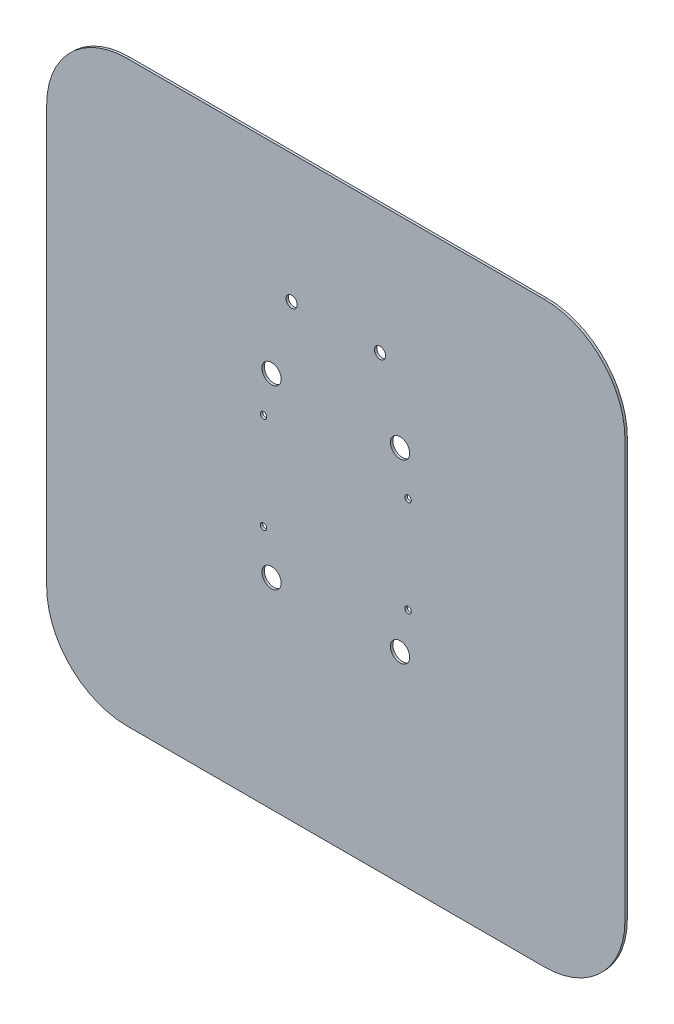
ISO-10303-21;
HEADER;
FILE_DESCRIPTION(('STEP AP214'),'2;1');
FILE_NAME('part.step','',(''),(''),'','','');
FILE_SCHEMA(('AUTOMOTIVE_DESIGN { 1 0 10303 214 1 1 1 1 }'));
ENDSEC;
DATA;
#1=APPLICATION_CONTEXT('core data for automotive mechanical design processes');
#2=APPLICATION_PROTOCOL_DEFINITION('international standard','automotive_design',2000,#1);
#3=PRODUCT_CONTEXT('',#1,'mechanical');
#4=PRODUCT('Part','Part','',(#3));
#5=PRODUCT_RELATED_PRODUCT_CATEGORY('part','',(#4));
#6=PRODUCT_DEFINITION_FORMATION('','',#4);
#7=PRODUCT_DEFINITION_CONTEXT('part definition',#1,'design');
#8=PRODUCT_DEFINITION('design','',#6,#7);
#9=PRODUCT_DEFINITION_SHAPE('','',#8);
#10=(LENGTH_UNIT() NAMED_UNIT(*) SI_UNIT(.MILLI.,.METRE.));
#11=(NAMED_UNIT(*) PLANE_ANGLE_UNIT() SI_UNIT($,.RADIAN.));
#12=(NAMED_UNIT(*) SI_UNIT($,.STERADIAN.) SOLID_ANGLE_UNIT());
#13=UNCERTAINTY_MEASURE_WITH_UNIT(LENGTH_MEASURE(1.E-05),#10,'distance_accuracy_value','');
#14=(GEOMETRIC_REPRESENTATION_CONTEXT(3) GLOBAL_UNCERTAINTY_ASSIGNED_CONTEXT((#13)) GLOBAL_UNIT_ASSIGNED_CONTEXT((#10,
#11,#12)) REPRESENTATION_CONTEXT('',''));
#15=CARTESIAN_POINT('',(0.,0.,0.));
#16=DIRECTION('',(0.,0.,1.));
#17=DIRECTION('',(1.,0.,0.));
#18=AXIS2_PLACEMENT_3D('',#15,#16,#17);
#19=CARTESIAN_POINT('',(50.,50.,1.5));
#20=DIRECTION('',(0.,0.,-1.));
#21=DIRECTION('',(-1.,0.,0.));
#22=AXIS2_PLACEMENT_3D('',#19,#20,#21);
#23=CYLINDRICAL_SURFACE('',#22,50.);
#24=CARTESIAN_POINT('',(50.,50.,0.));
#25=DIRECTION('',(0.,0.,1.));
#26=DIRECTION('',(1.,0.,0.));
#27=AXIS2_PLACEMENT_3D('',#24,#25,#26);
#28=CIRCLE('',#27,50.);
#29=CARTESIAN_POINT('',(0.,50.,0.));
#30=VERTEX_POINT('',#29);
#31=CARTESIAN_POINT('',(50.,0.,0.));
#32=VERTEX_POINT('',#31);
#33=EDGE_CURVE('E132',#30,#32,#28,.T.);
#34=ORIENTED_EDGE('',*,*,#33,.T.);
#35=DIRECTION('',(0.,0.,-1.));
#36=VECTOR('',#35,1.);
#37=CARTESIAN_POINT('',(50.,0.,1.5));
#38=LINE('',#37,#36);
#39=CARTESIAN_POINT('',(50.,0.,1.5));
#40=VERTEX_POINT('',#39);
#41=EDGE_CURVE('E11',#40,#32,#38,.T.);
#42=ORIENTED_EDGE('',*,*,#41,.F.);
#43=CARTESIAN_POINT('',(50.,50.,1.5));
#44=DIRECTION('',(0.,0.,1.));
#45=DIRECTION('',(1.,0.,0.));
#46=AXIS2_PLACEMENT_3D('',#43,#44,#45);
#47=CIRCLE('',#46,50.);
#48=CARTESIAN_POINT('',(0.,50.,1.5));
#49=VERTEX_POINT('',#48);
#50=EDGE_CURVE('E152',#49,#40,#47,.T.);
#51=ORIENTED_EDGE('',*,*,#50,.F.);
#52=DIRECTION('',(0.,0.,-1.));
#53=VECTOR('',#52,1.);
#54=CARTESIAN_POINT('',(0.,50.,1.5));
#55=LINE('',#54,#53);
#56=EDGE_CURVE('E52',#49,#30,#55,.T.);
#57=ORIENTED_EDGE('',*,*,#56,.T.);
#58=EDGE_LOOP('',(#34,#42,#51,#57));
#59=FACE_BOUND('',#58,.T.);
#60=ADVANCED_FACE('F36',(#59),#23,.T.);
#61=CARTESIAN_POINT('',(50.,0.,1.5));
#62=DIRECTION('',(0.,1.,0.));
#63=DIRECTION('',(0.,0.,1.));
#64=AXIS2_PLACEMENT_3D('',#61,#62,#63);
#65=PLANE('',#64);
#66=DIRECTION('',(1.,0.,0.));
#67=VECTOR('',#66,1.);
#68=CARTESIAN_POINT('',(50.,0.,0.));
#69=LINE('',#68,#67);
#70=CARTESIAN_POINT('',(310.,0.,0.));
#71=VERTEX_POINT('',#70);
#72=EDGE_CURVE('E134',#32,#71,#69,.T.);
#73=ORIENTED_EDGE('',*,*,#72,.T.);
#74=DIRECTION('',(0.,0.,-1.));
#75=VECTOR('',#74,1.);
#76=CARTESIAN_POINT('',(310.,0.,1.5));
#77=LINE('',#76,#75);
#78=CARTESIAN_POINT('',(310.,0.,1.5));
#79=VERTEX_POINT('',#78);
#80=EDGE_CURVE('E44',#79,#71,#77,.T.);
#81=ORIENTED_EDGE('',*,*,#80,.F.);
#82=DIRECTION('',(1.,0.,0.));
#83=VECTOR('',#82,1.);
#84=CARTESIAN_POINT('',(50.,0.,1.5));
#85=LINE('',#84,#83);
#86=EDGE_CURVE('E90',#40,#79,#85,.T.);
#87=ORIENTED_EDGE('',*,*,#86,.F.);
#88=ORIENTED_EDGE('',*,*,#41,.T.);
#89=EDGE_LOOP('',(#73,#81,#87,#88));
#90=FACE_BOUND('',#89,.T.);
#91=ADVANCED_FACE('F166',(#90),#65,.F.);
#92=CARTESIAN_POINT('',(310.,50.,1.5));
#93=DIRECTION('',(0.,0.,-1.));
#94=DIRECTION('',(-1.,0.,0.));
#95=AXIS2_PLACEMENT_3D('',#92,#93,#94);
#96=CYLINDRICAL_SURFACE('',#95,50.);
#97=CARTESIAN_POINT('',(310.,50.,0.));
#98=DIRECTION('',(0.,0.,-1.));
#99=DIRECTION('',(-1.,0.,0.));
#100=AXIS2_PLACEMENT_3D('',#97,#98,#99);
#101=CIRCLE('',#100,50.);
#102=CARTESIAN_POINT('',(360.,50.,0.));
#103=VERTEX_POINT('',#102);
#104=EDGE_CURVE('E138',#103,#71,#101,.T.);
#105=ORIENTED_EDGE('',*,*,#104,.F.);
#106=DIRECTION('',(0.,0.,-1.));
#107=VECTOR('',#106,1.);
#108=CARTESIAN_POINT('',(360.,50.,1.5));
#109=LINE('',#108,#107);
#110=CARTESIAN_POINT('',(360.,50.,1.5));
#111=VERTEX_POINT('',#110);
#112=EDGE_CURVE('E159',#111,#103,#109,.T.);
#113=ORIENTED_EDGE('',*,*,#112,.F.);
#114=CARTESIAN_POINT('',(310.,50.,1.5));
#115=DIRECTION('',(0.,0.,-1.));
#116=DIRECTION('',(-1.,0.,0.));
#117=AXIS2_PLACEMENT_3D('',#114,#115,#116);
#118=CIRCLE('',#117,50.);
#119=EDGE_CURVE('E165',#111,#79,#118,.T.);
#120=ORIENTED_EDGE('',*,*,#119,.T.);
#121=ORIENTED_EDGE('',*,*,#80,.T.);
#122=EDGE_LOOP('',(#105,#113,#120,#121));
#123=FACE_BOUND('',#122,.T.);
#124=ADVANCED_FACE('F163',(#123),#96,.T.);
#125=CARTESIAN_POINT('',(360.,50.,1.5));
#126=DIRECTION('',(-1.,0.,0.));
#127=DIRECTION('',(0.,-1.,0.));
#128=AXIS2_PLACEMENT_3D('',#125,#126,#127);
#129=PLANE('',#128);
#130=DIRECTION('',(0.,1.,0.));
#131=VECTOR('',#130,1.);
#132=CARTESIAN_POINT('',(360.,50.,0.));
#133=LINE('',#132,#131);
#134=CARTESIAN_POINT('',(360.,310.,0.));
#135=VERTEX_POINT('',#134);
#136=EDGE_CURVE('E141',#103,#135,#133,.T.);
#137=ORIENTED_EDGE('',*,*,#136,.T.);
#138=DIRECTION('',(0.,0.,-1.));
#139=VECTOR('',#138,1.);
#140=CARTESIAN_POINT('',(360.,310.,1.5));
#141=LINE('',#140,#139);
#142=CARTESIAN_POINT('',(360.,310.,1.5));
#143=VERTEX_POINT('',#142);
#144=EDGE_CURVE('E156',#143,#135,#141,.T.);
#145=ORIENTED_EDGE('',*,*,#144,.F.);
#146=DIRECTION('',(0.,1.,0.));
#147=VECTOR('',#146,1.);
#148=CARTESIAN_POINT('',(360.,50.,1.5));
#149=LINE('',#148,#147);
#150=EDGE_CURVE('E178',#111,#143,#149,.T.);
#151=ORIENTED_EDGE('',*,*,#150,.F.);
#152=ORIENTED_EDGE('',*,*,#112,.T.);
#153=EDGE_LOOP('',(#137,#145,#151,#152));
#154=FACE_BOUND('',#153,.T.);
#155=ADVANCED_FACE('F174',(#154),#129,.F.);
#156=CARTESIAN_POINT('',(310.,310.,1.5));
#157=DIRECTION('',(0.,0.,-1.));
#158=DIRECTION('',(-1.,0.,0.));
#159=AXIS2_PLACEMENT_3D('',#156,#157,#158);
#160=CYLINDRICAL_SURFACE('',#159,50.);
#161=CARTESIAN_POINT('',(310.,310.,0.));
#162=DIRECTION('',(0.,0.,1.));
#163=DIRECTION('',(1.,0.,0.));
#164=AXIS2_PLACEMENT_3D('',#161,#162,#163);
#165=CIRCLE('',#164,50.);
#166=CARTESIAN_POINT('',(310.,360.,0.));
#167=VERTEX_POINT('',#166);
#168=EDGE_CURVE('E143',#135,#167,#165,.T.);
#169=ORIENTED_EDGE('',*,*,#168,.T.);
#170=DIRECTION('',(0.,0.,-1.));
#171=VECTOR('',#170,1.);
#172=CARTESIAN_POINT('',(310.,360.,1.5));
#173=LINE('',#172,#171);
#174=CARTESIAN_POINT('',(310.,360.,1.5));
#175=VERTEX_POINT('',#174);
#176=EDGE_CURVE('E115',#175,#167,#173,.T.);
#177=ORIENTED_EDGE('',*,*,#176,.F.);
#178=CARTESIAN_POINT('',(310.,310.,1.5));
#179=DIRECTION('',(0.,0.,1.));
#180=DIRECTION('',(1.,0.,0.));
#181=AXIS2_PLACEMENT_3D('',#178,#179,#180);
#182=CIRCLE('',#181,50.);
#183=EDGE_CURVE('E123',#143,#175,#182,.T.);
#184=ORIENTED_EDGE('',*,*,#183,.F.);
#185=ORIENTED_EDGE('',*,*,#144,.T.);
#186=EDGE_LOOP('',(#169,#177,#184,#185));
#187=FACE_BOUND('',#186,.T.);
#188=ADVANCED_FACE('F177',(#187),#160,.T.);
#189=CARTESIAN_POINT('',(50.,360.,1.5));
#190=DIRECTION('',(0.,1.,0.));
#191=DIRECTION('',(0.,0.,1.));
#192=AXIS2_PLACEMENT_3D('',#189,#190,#191);
#193=PLANE('',#192);
#194=DIRECTION('',(1.,0.,0.));
#195=VECTOR('',#194,1.);
#196=CARTESIAN_POINT('',(50.,360.,0.));
#197=LINE('',#196,#195);
#198=CARTESIAN_POINT('',(50.,360.,0.));
#199=VERTEX_POINT('',#198);
#200=EDGE_CURVE('E111',#199,#167,#197,.T.);
#201=ORIENTED_EDGE('',*,*,#200,.F.);
#202=DIRECTION('',(0.,0.,-1.));
#203=VECTOR('',#202,1.);
#204=CARTESIAN_POINT('',(50.,360.,1.5));
#205=LINE('',#204,#203);
#206=CARTESIAN_POINT('',(50.,360.,1.5));
#207=VERTEX_POINT('',#206);
#208=EDGE_CURVE('E106',#207,#199,#205,.T.);
#209=ORIENTED_EDGE('',*,*,#208,.F.);
#210=DIRECTION('',(1.,0.,0.));
#211=VECTOR('',#210,1.);
#212=CARTESIAN_POINT('',(50.,360.,1.5));
#213=LINE('',#212,#211);
#214=EDGE_CURVE('E109',#207,#175,#213,.T.);
#215=ORIENTED_EDGE('',*,*,#214,.T.);
#216=ORIENTED_EDGE('',*,*,#176,.T.);
#217=EDGE_LOOP('',(#201,#209,#215,#216));
#218=FACE_BOUND('',#217,.T.);
#219=ADVANCED_FACE('F108',(#218),#193,.T.);
#220=CARTESIAN_POINT('',(50.,310.,1.5));
#221=DIRECTION('',(0.,0.,-1.));
#222=DIRECTION('',(-1.,0.,0.));
#223=AXIS2_PLACEMENT_3D('',#220,#221,#222);
#224=CYLINDRICAL_SURFACE('',#223,50.);
#225=CARTESIAN_POINT('',(50.,310.,0.));
#226=DIRECTION('',(0.,0.,-1.));
#227=DIRECTION('',(-1.,0.,0.));
#228=AXIS2_PLACEMENT_3D('',#225,#226,#227);
#229=CIRCLE('',#228,50.);
#230=CARTESIAN_POINT('',(0.,310.,0.));
#231=VERTEX_POINT('',#230);
#232=EDGE_CURVE('E147',#231,#199,#229,.T.);
#233=ORIENTED_EDGE('',*,*,#232,.F.);
#234=DIRECTION('',(0.,0.,-1.));
#235=VECTOR('',#234,1.);
#236=CARTESIAN_POINT('',(0.,310.,1.5));
#237=LINE('',#236,#235);
#238=CARTESIAN_POINT('',(0.,310.,1.5));
#239=VERTEX_POINT('',#238);
#240=EDGE_CURVE('E78',#239,#231,#237,.T.);
#241=ORIENTED_EDGE('',*,*,#240,.F.);
#242=CARTESIAN_POINT('',(50.,310.,1.5));
#243=DIRECTION('',(0.,0.,-1.));
#244=DIRECTION('',(-1.,0.,0.));
#245=AXIS2_PLACEMENT_3D('',#242,#243,#244);
#246=CIRCLE('',#245,50.);
#247=EDGE_CURVE('E121',#239,#207,#246,.T.);
#248=ORIENTED_EDGE('',*,*,#247,.T.);
#249=ORIENTED_EDGE('',*,*,#208,.T.);
#250=EDGE_LOOP('',(#233,#241,#248,#249));
#251=FACE_BOUND('',#250,.T.);
#252=ADVANCED_FACE('F126',(#251),#224,.T.);
#253=CARTESIAN_POINT('',(0.,50.,1.5));
#254=DIRECTION('',(-1.,0.,0.));
#255=DIRECTION('',(0.,0.,1.));
#256=AXIS2_PLACEMENT_3D('',#253,#254,#255);
#257=PLANE('',#256);
#258=DIRECTION('',(0.,1.,0.));
#259=VECTOR('',#258,1.);
#260=CARTESIAN_POINT('',(0.,50.,0.));
#261=LINE('',#260,#259);
#262=EDGE_CURVE('E149',#30,#231,#261,.T.);
#263=ORIENTED_EDGE('',*,*,#262,.F.);
#264=ORIENTED_EDGE('',*,*,#56,.F.);
#265=DIRECTION('',(0.,1.,0.));
#266=VECTOR('',#265,1.);
#267=CARTESIAN_POINT('',(0.,50.,1.5));
#268=LINE('',#267,#266);
#269=EDGE_CURVE('E127',#49,#239,#268,.T.);
#270=ORIENTED_EDGE('',*,*,#269,.T.);
#271=ORIENTED_EDGE('',*,*,#240,.T.);
#272=EDGE_LOOP('',(#263,#264,#270,#271));
#273=FACE_BOUND('',#272,.T.);
#274=ADVANCED_FACE('F248',(#273),#257,.T.);
#275=CARTESIAN_POINT('',(50.,50.,1.5));
#276=DIRECTION('',(0.,0.,1.));
#277=DIRECTION('',(1.,0.,0.));
#278=AXIS2_PLACEMENT_3D('',#275,#276,#277);
#279=PLANE('',#278);
#280=CARTESIAN_POINT('',(140.,235.,1.5));
#281=DIRECTION('',(0.,0.,1.));
#282=DIRECTION('',(1.,0.,0.));
#283=AXIS2_PLACEMENT_3D('',#280,#281,#282);
#284=CIRCLE('',#283,6.00000000000001);
#285=CARTESIAN_POINT('',(146.,235.,1.5));
#286=VERTEX_POINT('',#285);
#287=EDGE_CURVE('E240',#286,#286,#284,.T.);
#288=ORIENTED_EDGE('',*,*,#287,.F.);
#289=EDGE_LOOP('',(#288));
#290=FACE_BOUND('',#289,.T.);
#291=CARTESIAN_POINT('',(220.,235.,1.5));
#292=DIRECTION('',(0.,0.,1.));
#293=DIRECTION('',(1.,0.,0.));
#294=AXIS2_PLACEMENT_3D('',#291,#292,#293);
#295=CIRCLE('',#294,6.00000000000001);
#296=CARTESIAN_POINT('',(226.,235.,1.5));
#297=VERTEX_POINT('',#296);
#298=EDGE_CURVE('E234',#297,#297,#295,.T.);
#299=ORIENTED_EDGE('',*,*,#298,.F.);
#300=EDGE_LOOP('',(#299));
#301=FACE_BOUND('',#300,.T.);
#302=CARTESIAN_POINT('',(140.,125.,1.5));
#303=DIRECTION('',(0.,0.,1.));
#304=DIRECTION('',(1.,0.,0.));
#305=AXIS2_PLACEMENT_3D('',#302,#303,#304);
#306=CIRCLE('',#305,6.00000000000001);
#307=CARTESIAN_POINT('',(146.,125.,1.5));
#308=VERTEX_POINT('',#307);
#309=EDGE_CURVE('E228',#308,#308,#306,.T.);
#310=ORIENTED_EDGE('',*,*,#309,.F.);
#311=EDGE_LOOP('',(#310));
#312=FACE_BOUND('',#311,.T.);
#313=CARTESIAN_POINT('',(220.,125.,1.5));
#314=DIRECTION('',(0.,0.,1.));
#315=DIRECTION('',(1.,0.,0.));
#316=AXIS2_PLACEMENT_3D('',#313,#314,#315);
#317=CIRCLE('',#316,6.00000000000001);
#318=CARTESIAN_POINT('',(226.,125.,1.5));
#319=VERTEX_POINT('',#318);
#320=EDGE_CURVE('E222',#319,#319,#317,.T.);
#321=ORIENTED_EDGE('',*,*,#320,.F.);
#322=EDGE_LOOP('',(#321));
#323=FACE_BOUND('',#322,.T.);
#324=CARTESIAN_POINT('',(152.5,280.,1.5));
#325=DIRECTION('',(0.,0.,1.));
#326=DIRECTION('',(1.,0.,0.));
#327=AXIS2_PLACEMENT_3D('',#324,#325,#326);
#328=CIRCLE('',#327,3.5);
#329=CARTESIAN_POINT('',(156.,280.,1.5));
#330=VERTEX_POINT('',#329);
#331=EDGE_CURVE('E216',#330,#330,#328,.T.);
#332=ORIENTED_EDGE('',*,*,#331,.F.);
#333=EDGE_LOOP('',(#332));
#334=FACE_BOUND('',#333,.T.);
#335=CARTESIAN_POINT('',(207.5,280.,1.5));
#336=DIRECTION('',(0.,0.,1.));
#337=DIRECTION('',(1.,0.,0.));
#338=AXIS2_PLACEMENT_3D('',#335,#336,#337);
#339=CIRCLE('',#338,3.5);
#340=CARTESIAN_POINT('',(211.,280.,1.5));
#341=VERTEX_POINT('',#340);
#342=EDGE_CURVE('E210',#341,#341,#339,.T.);
#343=ORIENTED_EDGE('',*,*,#342,.F.);
#344=EDGE_LOOP('',(#343));
#345=FACE_BOUND('',#344,.T.);
#346=CARTESIAN_POINT('',(135.,210.,1.5));
#347=DIRECTION('',(0.,0.,1.));
#348=DIRECTION('',(1.,0.,0.));
#349=AXIS2_PLACEMENT_3D('',#346,#347,#348);
#350=CIRCLE('',#349,2.);
#351=CARTESIAN_POINT('',(137.,210.,1.5));
#352=VERTEX_POINT('',#351);
#353=EDGE_CURVE('E204',#352,#352,#350,.T.);
#354=ORIENTED_EDGE('',*,*,#353,.F.);
#355=EDGE_LOOP('',(#354));
#356=FACE_BOUND('',#355,.T.);
#357=CARTESIAN_POINT('',(225.,210.,1.5));
#358=DIRECTION('',(0.,0.,1.));
#359=DIRECTION('',(1.,0.,0.));
#360=AXIS2_PLACEMENT_3D('',#357,#358,#359);
#361=CIRCLE('',#360,2.);
#362=CARTESIAN_POINT('',(227.,210.,1.5));
#363=VERTEX_POINT('',#362);
#364=EDGE_CURVE('E198',#363,#363,#361,.T.);
#365=ORIENTED_EDGE('',*,*,#364,.F.);
#366=EDGE_LOOP('',(#365));
#367=FACE_BOUND('',#366,.T.);
#368=CARTESIAN_POINT('',(225.,150.,1.5));
#369=DIRECTION('',(0.,0.,1.));
#370=DIRECTION('',(1.,0.,0.));
#371=AXIS2_PLACEMENT_3D('',#368,#369,#370);
#372=CIRCLE('',#371,2.);
#373=CARTESIAN_POINT('',(227.,150.,1.5));
#374=VERTEX_POINT('',#373);
#375=EDGE_CURVE('E192',#374,#374,#372,.T.);
#376=ORIENTED_EDGE('',*,*,#375,.F.);
#377=EDGE_LOOP('',(#376));
#378=FACE_BOUND('',#377,.T.);
#379=CARTESIAN_POINT('',(135.,150.,1.5));
#380=DIRECTION('',(0.,0.,1.));
#381=DIRECTION('',(1.,0.,0.));
#382=AXIS2_PLACEMENT_3D('',#379,#380,#381);
#383=CIRCLE('',#382,2.);
#384=CARTESIAN_POINT('',(137.,150.,1.5));
#385=VERTEX_POINT('',#384);
#386=EDGE_CURVE('E186',#385,#385,#383,.T.);
#387=ORIENTED_EDGE('',*,*,#386,.F.);
#388=EDGE_LOOP('',(#387));
#389=FACE_BOUND('',#388,.T.);
#390=ORIENTED_EDGE('',*,*,#50,.T.);
#391=ORIENTED_EDGE('',*,*,#86,.T.);
#392=ORIENTED_EDGE('',*,*,#119,.F.);
#393=ORIENTED_EDGE('',*,*,#150,.T.);
#394=ORIENTED_EDGE('',*,*,#183,.T.);
#395=ORIENTED_EDGE('',*,*,#214,.F.);
#396=ORIENTED_EDGE('',*,*,#247,.F.);
#397=ORIENTED_EDGE('',*,*,#269,.F.);
#398=EDGE_LOOP('',(#390,#391,#392,#393,#394,#395,#396,#397));
#399=FACE_BOUND('',#398,.T.);
#400=ADVANCED_FACE('F119',(#290,#301,#312,#323,#334,#345,#356,#367,#378,#389,#399),#279,.T.);
#401=CARTESIAN_POINT('',(50.,50.,0.));
#402=DIRECTION('',(0.,0.,1.));
#403=DIRECTION('',(1.,0.,0.));
#404=AXIS2_PLACEMENT_3D('',#401,#402,#403);
#405=PLANE('',#404);
#406=CARTESIAN_POINT('',(140.,235.,0.));
#407=DIRECTION('',(0.,0.,1.));
#408=DIRECTION('',(1.,0.,0.));
#409=AXIS2_PLACEMENT_3D('',#406,#407,#408);
#410=CIRCLE('',#409,6.00000000000001);
#411=CARTESIAN_POINT('',(146.,235.,0.));
#412=VERTEX_POINT('',#411);
#413=EDGE_CURVE('E237',#412,#412,#410,.T.);
#414=ORIENTED_EDGE('',*,*,#413,.T.);
#415=EDGE_LOOP('',(#414));
#416=FACE_BOUND('',#415,.T.);
#417=CARTESIAN_POINT('',(220.,235.,0.));
#418=DIRECTION('',(0.,0.,1.));
#419=DIRECTION('',(1.,0.,0.));
#420=AXIS2_PLACEMENT_3D('',#417,#418,#419);
#421=CIRCLE('',#420,6.00000000000001);
#422=CARTESIAN_POINT('',(226.,235.,0.));
#423=VERTEX_POINT('',#422);
#424=EDGE_CURVE('E231',#423,#423,#421,.T.);
#425=ORIENTED_EDGE('',*,*,#424,.T.);
#426=EDGE_LOOP('',(#425));
#427=FACE_BOUND('',#426,.T.);
#428=CARTESIAN_POINT('',(140.,125.,0.));
#429=DIRECTION('',(0.,0.,1.));
#430=DIRECTION('',(1.,0.,0.));
#431=AXIS2_PLACEMENT_3D('',#428,#429,#430);
#432=CIRCLE('',#431,6.00000000000001);
#433=CARTESIAN_POINT('',(146.,125.,0.));
#434=VERTEX_POINT('',#433);
#435=EDGE_CURVE('E225',#434,#434,#432,.T.);
#436=ORIENTED_EDGE('',*,*,#435,.T.);
#437=EDGE_LOOP('',(#436));
#438=FACE_BOUND('',#437,.T.);
#439=CARTESIAN_POINT('',(220.,125.,0.));
#440=DIRECTION('',(0.,0.,1.));
#441=DIRECTION('',(1.,0.,0.));
#442=AXIS2_PLACEMENT_3D('',#439,#440,#441);
#443=CIRCLE('',#442,6.00000000000001);
#444=CARTESIAN_POINT('',(226.,125.,0.));
#445=VERTEX_POINT('',#444);
#446=EDGE_CURVE('E219',#445,#445,#443,.T.);
#447=ORIENTED_EDGE('',*,*,#446,.T.);
#448=EDGE_LOOP('',(#447));
#449=FACE_BOUND('',#448,.T.);
#450=CARTESIAN_POINT('',(152.5,280.,0.));
#451=DIRECTION('',(0.,0.,1.));
#452=DIRECTION('',(1.,0.,0.));
#453=AXIS2_PLACEMENT_3D('',#450,#451,#452);
#454=CIRCLE('',#453,3.5);
#455=CARTESIAN_POINT('',(156.,280.,0.));
#456=VERTEX_POINT('',#455);
#457=EDGE_CURVE('E213',#456,#456,#454,.T.);
#458=ORIENTED_EDGE('',*,*,#457,.T.);
#459=EDGE_LOOP('',(#458));
#460=FACE_BOUND('',#459,.T.);
#461=CARTESIAN_POINT('',(207.5,280.,0.));
#462=DIRECTION('',(0.,0.,1.));
#463=DIRECTION('',(1.,0.,0.));
#464=AXIS2_PLACEMENT_3D('',#461,#462,#463);
#465=CIRCLE('',#464,3.5);
#466=CARTESIAN_POINT('',(211.,280.,0.));
#467=VERTEX_POINT('',#466);
#468=EDGE_CURVE('E207',#467,#467,#465,.T.);
#469=ORIENTED_EDGE('',*,*,#468,.T.);
#470=EDGE_LOOP('',(#469));
#471=FACE_BOUND('',#470,.T.);
#472=CARTESIAN_POINT('',(135.,210.,0.));
#473=DIRECTION('',(0.,0.,1.));
#474=DIRECTION('',(1.,0.,0.));
#475=AXIS2_PLACEMENT_3D('',#472,#473,#474);
#476=CIRCLE('',#475,2.);
#477=CARTESIAN_POINT('',(137.,210.,0.));
#478=VERTEX_POINT('',#477);
#479=EDGE_CURVE('E201',#478,#478,#476,.T.);
#480=ORIENTED_EDGE('',*,*,#479,.T.);
#481=EDGE_LOOP('',(#480));
#482=FACE_BOUND('',#481,.T.);
#483=CARTESIAN_POINT('',(225.,210.,0.));
#484=DIRECTION('',(0.,0.,1.));
#485=DIRECTION('',(1.,0.,0.));
#486=AXIS2_PLACEMENT_3D('',#483,#484,#485);
#487=CIRCLE('',#486,2.);
#488=CARTESIAN_POINT('',(227.,210.,0.));
#489=VERTEX_POINT('',#488);
#490=EDGE_CURVE('E195',#489,#489,#487,.T.);
#491=ORIENTED_EDGE('',*,*,#490,.T.);
#492=EDGE_LOOP('',(#491));
#493=FACE_BOUND('',#492,.T.);
#494=CARTESIAN_POINT('',(225.,150.,0.));
#495=DIRECTION('',(0.,0.,1.));
#496=DIRECTION('',(1.,0.,0.));
#497=AXIS2_PLACEMENT_3D('',#494,#495,#496);
#498=CIRCLE('',#497,2.);
#499=CARTESIAN_POINT('',(227.,150.,0.));
#500=VERTEX_POINT('',#499);
#501=EDGE_CURVE('E189',#500,#500,#498,.T.);
#502=ORIENTED_EDGE('',*,*,#501,.T.);
#503=EDGE_LOOP('',(#502));
#504=FACE_BOUND('',#503,.T.);
#505=CARTESIAN_POINT('',(135.,150.,0.));
#506=DIRECTION('',(0.,0.,1.));
#507=DIRECTION('',(1.,0.,0.));
#508=AXIS2_PLACEMENT_3D('',#505,#506,#507);
#509=CIRCLE('',#508,2.);
#510=CARTESIAN_POINT('',(137.,150.,0.));
#511=VERTEX_POINT('',#510);
#512=EDGE_CURVE('E135',#511,#511,#509,.T.);
#513=ORIENTED_EDGE('',*,*,#512,.T.);
#514=EDGE_LOOP('',(#513));
#515=FACE_BOUND('',#514,.T.);
#516=ORIENTED_EDGE('',*,*,#33,.F.);
#517=ORIENTED_EDGE('',*,*,#262,.T.);
#518=ORIENTED_EDGE('',*,*,#232,.T.);
#519=ORIENTED_EDGE('',*,*,#200,.T.);
#520=ORIENTED_EDGE('',*,*,#168,.F.);
#521=ORIENTED_EDGE('',*,*,#136,.F.);
#522=ORIENTED_EDGE('',*,*,#104,.T.);
#523=ORIENTED_EDGE('',*,*,#72,.F.);
#524=EDGE_LOOP('',(#516,#517,#518,#519,#520,#521,#522,#523));
#525=FACE_BOUND('',#524,.T.);
#526=ADVANCED_FACE('F170',(#416,#427,#438,#449,#460,#471,#482,#493,#504,#515,#525),#405,.F.);
#527=CARTESIAN_POINT('',(135.,150.,1.5));
#528=DIRECTION('',(0.,0.,1.));
#529=DIRECTION('',(1.,0.,0.));
#530=AXIS2_PLACEMENT_3D('',#527,#528,#529);
#531=CYLINDRICAL_SURFACE('',#530,2.);
#532=ORIENTED_EDGE('',*,*,#512,.F.);
#533=EDGE_LOOP('',(#532));
#534=FACE_BOUND('',#533,.T.);
#535=ORIENTED_EDGE('',*,*,#386,.T.);
#536=EDGE_LOOP('',(#535));
#537=FACE_BOUND('',#536,.T.);
#538=ADVANCED_FACE('F268',(#534,#537),#531,.F.);
#539=CARTESIAN_POINT('',(225.,150.,1.5));
#540=DIRECTION('',(0.,0.,1.));
#541=DIRECTION('',(1.,0.,0.));
#542=AXIS2_PLACEMENT_3D('',#539,#540,#541);
#543=CYLINDRICAL_SURFACE('',#542,2.);
#544=ORIENTED_EDGE('',*,*,#501,.F.);
#545=EDGE_LOOP('',(#544));
#546=FACE_BOUND('',#545,.T.);
#547=ORIENTED_EDGE('',*,*,#375,.T.);
#548=EDGE_LOOP('',(#547));
#549=FACE_BOUND('',#548,.T.);
#550=ADVANCED_FACE('F270',(#546,#549),#543,.F.);
#551=CARTESIAN_POINT('',(225.,210.,1.5));
#552=DIRECTION('',(0.,0.,1.));
#553=DIRECTION('',(1.,0.,0.));
#554=AXIS2_PLACEMENT_3D('',#551,#552,#553);
#555=CYLINDRICAL_SURFACE('',#554,2.);
#556=ORIENTED_EDGE('',*,*,#490,.F.);
#557=EDGE_LOOP('',(#556));
#558=FACE_BOUND('',#557,.T.);
#559=ORIENTED_EDGE('',*,*,#364,.T.);
#560=EDGE_LOOP('',(#559));
#561=FACE_BOUND('',#560,.T.);
#562=ADVANCED_FACE('F277',(#558,#561),#555,.F.);
#563=CARTESIAN_POINT('',(135.,210.,1.5));
#564=DIRECTION('',(0.,0.,1.));
#565=DIRECTION('',(1.,0.,0.));
#566=AXIS2_PLACEMENT_3D('',#563,#564,#565);
#567=CYLINDRICAL_SURFACE('',#566,2.);
#568=ORIENTED_EDGE('',*,*,#479,.F.);
#569=EDGE_LOOP('',(#568));
#570=FACE_BOUND('',#569,.T.);
#571=ORIENTED_EDGE('',*,*,#353,.T.);
#572=EDGE_LOOP('',(#571));
#573=FACE_BOUND('',#572,.T.);
#574=ADVANCED_FACE('F351',(#570,#573),#567,.F.);
#575=CARTESIAN_POINT('',(207.5,280.,1.5));
#576=DIRECTION('',(0.,0.,1.));
#577=DIRECTION('',(1.,0.,0.));
#578=AXIS2_PLACEMENT_3D('',#575,#576,#577);
#579=CYLINDRICAL_SURFACE('',#578,3.5);
#580=ORIENTED_EDGE('',*,*,#468,.F.);
#581=EDGE_LOOP('',(#580));
#582=FACE_BOUND('',#581,.T.);
#583=ORIENTED_EDGE('',*,*,#342,.T.);
#584=EDGE_LOOP('',(#583));
#585=FACE_BOUND('',#584,.T.);
#586=ADVANCED_FACE('F362',(#582,#585),#579,.F.);
#587=CARTESIAN_POINT('',(152.5,280.,1.5));
#588=DIRECTION('',(0.,0.,1.));
#589=DIRECTION('',(1.,0.,0.));
#590=AXIS2_PLACEMENT_3D('',#587,#588,#589);
#591=CYLINDRICAL_SURFACE('',#590,3.5);
#592=ORIENTED_EDGE('',*,*,#457,.F.);
#593=EDGE_LOOP('',(#592));
#594=FACE_BOUND('',#593,.T.);
#595=ORIENTED_EDGE('',*,*,#331,.T.);
#596=EDGE_LOOP('',(#595));
#597=FACE_BOUND('',#596,.T.);
#598=ADVANCED_FACE('F373',(#594,#597),#591,.F.);
#599=CARTESIAN_POINT('',(220.,125.,1.5));
#600=DIRECTION('',(0.,0.,1.));
#601=DIRECTION('',(1.,0.,0.));
#602=AXIS2_PLACEMENT_3D('',#599,#600,#601);
#603=CYLINDRICAL_SURFACE('',#602,6.00000000000001);
#604=ORIENTED_EDGE('',*,*,#446,.F.);
#605=EDGE_LOOP('',(#604));
#606=FACE_BOUND('',#605,.T.);
#607=ORIENTED_EDGE('',*,*,#320,.T.);
#608=EDGE_LOOP('',(#607));
#609=FACE_BOUND('',#608,.T.);
#610=ADVANCED_FACE('F383',(#606,#609),#603,.F.);
#611=CARTESIAN_POINT('',(140.,125.,1.5));
#612=DIRECTION('',(0.,0.,1.));
#613=DIRECTION('',(1.,0.,0.));
#614=AXIS2_PLACEMENT_3D('',#611,#612,#613);
#615=CYLINDRICAL_SURFACE('',#614,6.00000000000001);
#616=ORIENTED_EDGE('',*,*,#435,.F.);
#617=EDGE_LOOP('',(#616));
#618=FACE_BOUND('',#617,.T.);
#619=ORIENTED_EDGE('',*,*,#309,.T.);
#620=EDGE_LOOP('',(#619));
#621=FACE_BOUND('',#620,.T.);
#622=ADVANCED_FACE('F403',(#618,#621),#615,.F.);
#623=CARTESIAN_POINT('',(220.,235.,1.5));
#624=DIRECTION('',(0.,0.,1.));
#625=DIRECTION('',(1.,0.,0.));
#626=AXIS2_PLACEMENT_3D('',#623,#624,#625);
#627=CYLINDRICAL_SURFACE('',#626,6.00000000000001);
#628=ORIENTED_EDGE('',*,*,#424,.F.);
#629=EDGE_LOOP('',(#628));
#630=FACE_BOUND('',#629,.T.);
#631=ORIENTED_EDGE('',*,*,#298,.T.);
#632=EDGE_LOOP('',(#631));
#633=FACE_BOUND('',#632,.T.);
#634=ADVANCED_FACE('F413',(#630,#633),#627,.F.);
#635=CARTESIAN_POINT('',(140.,235.,1.5));
#636=DIRECTION('',(0.,0.,1.));
#637=DIRECTION('',(1.,0.,0.));
#638=AXIS2_PLACEMENT_3D('',#635,#636,#637);
#639=CYLINDRICAL_SURFACE('',#638,6.00000000000001);
#640=ORIENTED_EDGE('',*,*,#413,.F.);
#641=EDGE_LOOP('',(#640));
#642=FACE_BOUND('',#641,.T.);
#643=ORIENTED_EDGE('',*,*,#287,.T.);
#644=EDGE_LOOP('',(#643));
#645=FACE_BOUND('',#644,.T.);
#646=ADVANCED_FACE('F244',(#642,#645),#639,.F.);
#647=CLOSED_SHELL('',(#60,#91,#124,#155,#188,#219,#252,#274,#400,#526,#538,#550,#562,#574,#586,
#598,#610,#622,#634,#646));
#648=MANIFOLD_SOLID_BREP('B2',#647);
#649=ADVANCED_BREP_SHAPE_REPRESENTATION('',(#18,#648),#14);
#650=SHAPE_DEFINITION_REPRESENTATION(#9,#649);
ENDSEC;
END-ISO-10303-21;
